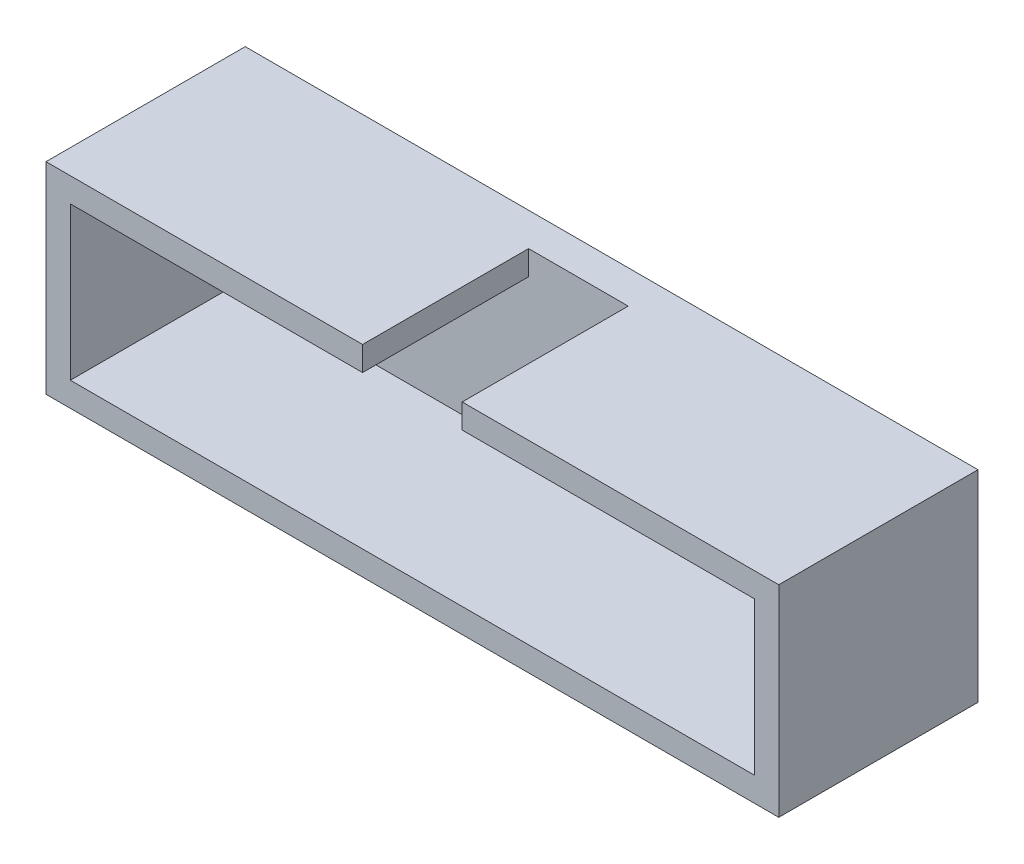
ISO-10303-21;
HEADER;
FILE_DESCRIPTION(('STEP AP214'),'2;1');
FILE_NAME('part.step','',(''),(''),'','','');
FILE_SCHEMA(('AUTOMOTIVE_DESIGN { 1 0 10303 214 1 1 1 1 }'));
ENDSEC;
DATA;
#1=APPLICATION_CONTEXT('core data for automotive mechanical design processes');
#2=APPLICATION_PROTOCOL_DEFINITION('international standard','automotive_design',2000,#1);
#3=PRODUCT_CONTEXT('',#1,'mechanical');
#4=PRODUCT('Part','Part','',(#3));
#5=PRODUCT_RELATED_PRODUCT_CATEGORY('part','',(#4));
#6=PRODUCT_DEFINITION_FORMATION('','',#4);
#7=PRODUCT_DEFINITION_CONTEXT('part definition',#1,'design');
#8=PRODUCT_DEFINITION('design','',#6,#7);
#9=PRODUCT_DEFINITION_SHAPE('','',#8);
#10=(LENGTH_UNIT() NAMED_UNIT(*) SI_UNIT(.MILLI.,.METRE.));
#11=(NAMED_UNIT(*) PLANE_ANGLE_UNIT() SI_UNIT($,.RADIAN.));
#12=(NAMED_UNIT(*) SI_UNIT($,.STERADIAN.) SOLID_ANGLE_UNIT());
#13=UNCERTAINTY_MEASURE_WITH_UNIT(LENGTH_MEASURE(1.E-05),#10,'distance_accuracy_value','');
#14=(GEOMETRIC_REPRESENTATION_CONTEXT(3) GLOBAL_UNCERTAINTY_ASSIGNED_CONTEXT((#13)) GLOBAL_UNIT_ASSIGNED_CONTEXT((#10,
#11,#12)) REPRESENTATION_CONTEXT('',''));
#15=CARTESIAN_POINT('',(0.,0.,0.));
#16=DIRECTION('',(0.,0.,1.));
#17=DIRECTION('',(1.,0.,0.));
#18=AXIS2_PLACEMENT_3D('',#15,#16,#17);
#19=CARTESIAN_POINT('',(15.45,3.45,1.5));
#20=DIRECTION('',(0.,1.,0.));
#21=DIRECTION('',(0.,0.,1.));
#22=AXIS2_PLACEMENT_3D('',#19,#20,#21);
#23=PLANE('',#22);
#24=DIRECTION('',(-1.,0.,0.));
#25=VECTOR('',#24,1.);
#26=CARTESIAN_POINT('',(15.45,3.45,9.));
#27=LINE('',#26,#25);
#28=CARTESIAN_POINT('',(15.45,3.45,9.));
#29=VERTEX_POINT('',#28);
#30=CARTESIAN_POINT('',(2.25,3.45,9.));
#31=VERTEX_POINT('',#30);
#32=EDGE_CURVE('E162',#29,#31,#27,.T.);
#33=ORIENTED_EDGE('',*,*,#32,.T.);
#34=DIRECTION('',(0.,0.,1.));
#35=VECTOR('',#34,1.);
#36=CARTESIAN_POINT('',(2.25,3.45,1.5));
#37=LINE('',#36,#35);
#38=CARTESIAN_POINT('',(2.25,3.45,1.5));
#39=VERTEX_POINT('',#38);
#40=EDGE_CURVE('E153',#39,#31,#37,.T.);
#41=ORIENTED_EDGE('',*,*,#40,.F.);
#42=DIRECTION('',(-1.,0.,0.));
#43=VECTOR('',#42,1.);
#44=CARTESIAN_POINT('',(15.45,3.45,1.5));
#45=LINE('',#44,#43);
#46=CARTESIAN_POINT('',(15.45,3.45,1.5));
#47=VERTEX_POINT('',#46);
#48=EDGE_CURVE('E143',#47,#39,#45,.T.);
#49=ORIENTED_EDGE('',*,*,#48,.F.);
#50=DIRECTION('',(0.,0.,1.));
#51=VECTOR('',#50,1.);
#52=CARTESIAN_POINT('',(15.45,3.45,1.5));
#53=LINE('',#52,#51);
#54=EDGE_CURVE('E183',#47,#29,#53,.T.);
#55=ORIENTED_EDGE('',*,*,#54,.T.);
#56=EDGE_LOOP('',(#33,#41,#49,#55));
#57=FACE_BOUND('',#56,.T.);
#58=ADVANCED_FACE('F35',(#57),#23,.F.);
#59=CARTESIAN_POINT('',(16.55,-4.55,9.));
#60=DIRECTION('',(-1.,0.,0.));
#61=DIRECTION('',(0.,0.,1.));
#62=AXIS2_PLACEMENT_3D('',#59,#60,#61);
#63=PLANE('',#62);
#64=DIRECTION('',(0.,1.,0.));
#65=VECTOR('',#64,1.);
#66=CARTESIAN_POINT('',(16.55,-4.55,0.));
#67=LINE('',#66,#65);
#68=CARTESIAN_POINT('',(16.55,-4.55,0.));
#69=VERTEX_POINT('',#68);
#70=CARTESIAN_POINT('',(16.55,4.55,0.));
#71=VERTEX_POINT('',#70);
#72=EDGE_CURVE('E182',#69,#71,#67,.T.);
#73=ORIENTED_EDGE('',*,*,#72,.T.);
#74=DIRECTION('',(0.,0.,-1.));
#75=VECTOR('',#74,1.);
#76=CARTESIAN_POINT('',(16.55,4.55,9.));
#77=LINE('',#76,#75);
#78=CARTESIAN_POINT('',(16.55,4.55,9.));
#79=VERTEX_POINT('',#78);
#80=EDGE_CURVE('E11',#79,#71,#77,.T.);
#81=ORIENTED_EDGE('',*,*,#80,.F.);
#82=DIRECTION('',(0.,1.,0.));
#83=VECTOR('',#82,1.);
#84=CARTESIAN_POINT('',(16.55,-4.55,9.));
#85=LINE('',#84,#83);
#86=CARTESIAN_POINT('',(16.55,-4.55,9.));
#87=VERTEX_POINT('',#86);
#88=EDGE_CURVE('E188',#87,#79,#85,.T.);
#89=ORIENTED_EDGE('',*,*,#88,.F.);
#90=DIRECTION('',(0.,0.,-1.));
#91=VECTOR('',#90,1.);
#92=CARTESIAN_POINT('',(16.55,-4.55,9.));
#93=LINE('',#92,#91);
#94=EDGE_CURVE('E199',#87,#69,#93,.T.);
#95=ORIENTED_EDGE('',*,*,#94,.T.);
#96=EDGE_LOOP('',(#73,#81,#89,#95));
#97=FACE_BOUND('',#96,.T.);
#98=ADVANCED_FACE('F37',(#97),#63,.F.);
#99=CARTESIAN_POINT('',(-16.55,4.55,9.));
#100=DIRECTION('',(0.,-1.,0.));
#101=DIRECTION('',(0.,0.,-1.));
#102=AXIS2_PLACEMENT_3D('',#99,#100,#101);
#103=PLANE('',#102);
#104=DIRECTION('',(-1.,0.,0.));
#105=VECTOR('',#104,1.);
#106=CARTESIAN_POINT('',(2.25,4.55,1.5));
#107=LINE('',#106,#105);
#108=CARTESIAN_POINT('',(2.25,4.55,1.5));
#109=VERTEX_POINT('',#108);
#110=CARTESIAN_POINT('',(-2.25,4.55,1.5));
#111=VERTEX_POINT('',#110);
#112=EDGE_CURVE('E139',#109,#111,#107,.T.);
#113=ORIENTED_EDGE('',*,*,#112,.F.);
#114=DIRECTION('',(0.,0.,1.));
#115=VECTOR('',#114,1.);
#116=CARTESIAN_POINT('',(2.25,4.55,1.5));
#117=LINE('',#116,#115);
#118=CARTESIAN_POINT('',(2.25,4.55,9.));
#119=VERTEX_POINT('',#118);
#120=EDGE_CURVE('E124',#109,#119,#117,.T.);
#121=ORIENTED_EDGE('',*,*,#120,.T.);
#122=DIRECTION('',(-1.,0.,0.));
#123=VECTOR('',#122,1.);
#124=CARTESIAN_POINT('',(-16.55,4.55,9.));
#125=LINE('',#124,#123);
#126=EDGE_CURVE('E193',#79,#119,#125,.T.);
#127=ORIENTED_EDGE('',*,*,#126,.F.);
#128=ORIENTED_EDGE('',*,*,#80,.T.);
#129=DIRECTION('',(-1.,0.,0.));
#130=VECTOR('',#129,1.);
#131=CARTESIAN_POINT('',(-16.55,4.55,0.));
#132=LINE('',#131,#130);
#133=CARTESIAN_POINT('',(-16.55,4.55,0.));
#134=VERTEX_POINT('',#133);
#135=EDGE_CURVE('E202',#71,#134,#132,.T.);
#136=ORIENTED_EDGE('',*,*,#135,.T.);
#137=DIRECTION('',(0.,0.,-1.));
#138=VECTOR('',#137,1.);
#139=CARTESIAN_POINT('',(-16.55,4.55,9.));
#140=LINE('',#139,#138);
#141=CARTESIAN_POINT('',(-16.55,4.55,9.));
#142=VERTEX_POINT('',#141);
#143=EDGE_CURVE('E43',#142,#134,#140,.T.);
#144=ORIENTED_EDGE('',*,*,#143,.F.);
#145=CARTESIAN_POINT('',(-2.25,4.55,9.));
#146=VERTEX_POINT('',#145);
#147=EDGE_CURVE('E191',#146,#142,#125,.T.);
#148=ORIENTED_EDGE('',*,*,#147,.F.);
#149=DIRECTION('',(0.,0.,1.));
#150=VECTOR('',#149,1.);
#151=CARTESIAN_POINT('',(-2.25,4.55,1.5));
#152=LINE('',#151,#150);
#153=EDGE_CURVE('E134',#111,#146,#152,.T.);
#154=ORIENTED_EDGE('',*,*,#153,.F.);
#155=EDGE_LOOP('',(#113,#121,#127,#128,#136,#144,#148,#154));
#156=FACE_BOUND('',#155,.T.);
#157=ADVANCED_FACE('F146',(#156),#103,.F.);
#158=CARTESIAN_POINT('',(-16.55,-4.55,9.));
#159=DIRECTION('',(1.,0.,0.));
#160=DIRECTION('',(0.,0.,-1.));
#161=AXIS2_PLACEMENT_3D('',#158,#159,#160);
#162=PLANE('',#161);
#163=DIRECTION('',(0.,-1.,0.));
#164=VECTOR('',#163,1.);
#165=CARTESIAN_POINT('',(-16.55,-4.55,0.));
#166=LINE('',#165,#164);
#167=CARTESIAN_POINT('',(-16.55,-4.55,0.));
#168=VERTEX_POINT('',#167);
#169=EDGE_CURVE('E204',#134,#168,#166,.T.);
#170=ORIENTED_EDGE('',*,*,#169,.T.);
#171=DIRECTION('',(0.,0.,-1.));
#172=VECTOR('',#171,1.);
#173=CARTESIAN_POINT('',(-16.55,-4.55,9.));
#174=LINE('',#173,#172);
#175=CARTESIAN_POINT('',(-16.55,-4.55,9.));
#176=VERTEX_POINT('',#175);
#177=EDGE_CURVE('E209',#176,#168,#174,.T.);
#178=ORIENTED_EDGE('',*,*,#177,.F.);
#179=DIRECTION('',(0.,-1.,0.));
#180=VECTOR('',#179,1.);
#181=CARTESIAN_POINT('',(-16.55,-4.55,9.));
#182=LINE('',#181,#180);
#183=EDGE_CURVE('E195',#142,#176,#182,.T.);
#184=ORIENTED_EDGE('',*,*,#183,.F.);
#185=ORIENTED_EDGE('',*,*,#143,.T.);
#186=EDGE_LOOP('',(#170,#178,#184,#185));
#187=FACE_BOUND('',#186,.T.);
#188=ADVANCED_FACE('F216',(#187),#162,.F.);
#189=CARTESIAN_POINT('',(-16.55,-4.55,9.));
#190=DIRECTION('',(0.,1.,0.));
#191=DIRECTION('',(0.,0.,1.));
#192=AXIS2_PLACEMENT_3D('',#189,#190,#191);
#193=PLANE('',#192);
#194=DIRECTION('',(1.,0.,0.));
#195=VECTOR('',#194,1.);
#196=CARTESIAN_POINT('',(-16.55,-4.55,0.));
#197=LINE('',#196,#195);
#198=EDGE_CURVE('E192',#168,#69,#197,.T.);
#199=ORIENTED_EDGE('',*,*,#198,.T.);
#200=ORIENTED_EDGE('',*,*,#94,.F.);
#201=DIRECTION('',(1.,0.,0.));
#202=VECTOR('',#201,1.);
#203=CARTESIAN_POINT('',(-16.55,-4.55,9.));
#204=LINE('',#203,#202);
#205=EDGE_CURVE('E197',#176,#87,#204,.T.);
#206=ORIENTED_EDGE('',*,*,#205,.F.);
#207=ORIENTED_EDGE('',*,*,#177,.T.);
#208=EDGE_LOOP('',(#199,#200,#206,#207));
#209=FACE_BOUND('',#208,.T.);
#210=ADVANCED_FACE('F224',(#209),#193,.F.);
#211=CARTESIAN_POINT('',(0.,0.,9.));
#212=DIRECTION('',(0.,0.,-1.));
#213=DIRECTION('',(-1.,0.,0.));
#214=AXIS2_PLACEMENT_3D('',#211,#212,#213);
#215=PLANE('',#214);
#216=ORIENTED_EDGE('',*,*,#126,.T.);
#217=DIRECTION('',(0.,1.,0.));
#218=VECTOR('',#217,1.);
#219=CARTESIAN_POINT('',(2.25,4.55,9.));
#220=LINE('',#219,#218);
#221=EDGE_CURVE('E130',#31,#119,#220,.T.);
#222=ORIENTED_EDGE('',*,*,#221,.F.);
#223=ORIENTED_EDGE('',*,*,#32,.F.);
#224=DIRECTION('',(0.,1.,0.));
#225=VECTOR('',#224,1.);
#226=CARTESIAN_POINT('',(15.45,-3.45,9.));
#227=LINE('',#226,#225);
#228=CARTESIAN_POINT('',(15.45,-3.45,9.));
#229=VERTEX_POINT('',#228);
#230=EDGE_CURVE('E174',#229,#29,#227,.T.);
#231=ORIENTED_EDGE('',*,*,#230,.F.);
#232=DIRECTION('',(1.,0.,0.));
#233=VECTOR('',#232,1.);
#234=CARTESIAN_POINT('',(15.45,-3.45,9.));
#235=LINE('',#234,#233);
#236=CARTESIAN_POINT('',(-15.45,-3.45,9.));
#237=VERTEX_POINT('',#236);
#238=EDGE_CURVE('E171',#237,#229,#235,.T.);
#239=ORIENTED_EDGE('',*,*,#238,.F.);
#240=DIRECTION('',(0.,-1.,0.));
#241=VECTOR('',#240,1.);
#242=CARTESIAN_POINT('',(-15.45,-3.45,9.));
#243=LINE('',#242,#241);
#244=CARTESIAN_POINT('',(-15.45,3.45,9.));
#245=VERTEX_POINT('',#244);
#246=EDGE_CURVE('E58',#245,#237,#243,.T.);
#247=ORIENTED_EDGE('',*,*,#246,.F.);
#248=CARTESIAN_POINT('',(-2.25,3.45,9.));
#249=VERTEX_POINT('',#248);
#250=EDGE_CURVE('E177',#249,#245,#27,.T.);
#251=ORIENTED_EDGE('',*,*,#250,.F.);
#252=DIRECTION('',(0.,-1.,0.));
#253=VECTOR('',#252,1.);
#254=CARTESIAN_POINT('',(-2.25,4.55,9.));
#255=LINE('',#254,#253);
#256=EDGE_CURVE('E144',#146,#249,#255,.T.);
#257=ORIENTED_EDGE('',*,*,#256,.F.);
#258=ORIENTED_EDGE('',*,*,#147,.T.);
#259=ORIENTED_EDGE('',*,*,#183,.T.);
#260=ORIENTED_EDGE('',*,*,#205,.T.);
#261=ORIENTED_EDGE('',*,*,#88,.T.);
#262=EDGE_LOOP('',(#216,#222,#223,#231,#239,#247,#251,#257,#258,#259,#260,#261));
#263=FACE_BOUND('',#262,.T.);
#264=ADVANCED_FACE('F230',(#263),#215,.F.);
#265=CARTESIAN_POINT('',(0.,0.,0.));
#266=DIRECTION('',(0.,0.,-1.));
#267=DIRECTION('',(-1.,0.,0.));
#268=AXIS2_PLACEMENT_3D('',#265,#266,#267);
#269=PLANE('',#268);
#270=ORIENTED_EDGE('',*,*,#72,.F.);
#271=ORIENTED_EDGE('',*,*,#198,.F.);
#272=ORIENTED_EDGE('',*,*,#169,.F.);
#273=ORIENTED_EDGE('',*,*,#135,.F.);
#274=EDGE_LOOP('',(#270,#271,#272,#273));
#275=FACE_BOUND('',#274,.T.);
#276=ADVANCED_FACE('F221',(#275),#269,.T.);
#277=CARTESIAN_POINT('',(-15.45,-3.45,1.5));
#278=DIRECTION('',(-1.,0.,0.));
#279=DIRECTION('',(0.,0.,1.));
#280=AXIS2_PLACEMENT_3D('',#277,#278,#279);
#281=PLANE('',#280);
#282=ORIENTED_EDGE('',*,*,#246,.T.);
#283=DIRECTION('',(0.,0.,1.));
#284=VECTOR('',#283,1.);
#285=CARTESIAN_POINT('',(-15.45,-3.45,1.5));
#286=LINE('',#285,#284);
#287=CARTESIAN_POINT('',(-15.45,-3.45,1.5));
#288=VERTEX_POINT('',#287);
#289=EDGE_CURVE('E169',#288,#237,#286,.T.);
#290=ORIENTED_EDGE('',*,*,#289,.F.);
#291=DIRECTION('',(0.,-1.,0.));
#292=VECTOR('',#291,1.);
#293=CARTESIAN_POINT('',(-15.45,-3.45,1.5));
#294=LINE('',#293,#292);
#295=CARTESIAN_POINT('',(-15.45,3.45,1.5));
#296=VERTEX_POINT('',#295);
#297=EDGE_CURVE('E159',#296,#288,#294,.T.);
#298=ORIENTED_EDGE('',*,*,#297,.F.);
#299=DIRECTION('',(0.,0.,1.));
#300=VECTOR('',#299,1.);
#301=CARTESIAN_POINT('',(-15.45,3.45,1.5));
#302=LINE('',#301,#300);
#303=EDGE_CURVE('E180',#296,#245,#302,.T.);
#304=ORIENTED_EDGE('',*,*,#303,.T.);
#305=EDGE_LOOP('',(#282,#290,#298,#304));
#306=FACE_BOUND('',#305,.T.);
#307=ADVANCED_FACE('F241',(#306),#281,.F.);
#308=CARTESIAN_POINT('',(-2.24999999999999,3.45,1.5));
#309=VERTEX_POINT('',#308);
#310=EDGE_CURVE('E167',#309,#296,#45,.T.);
#311=ORIENTED_EDGE('',*,*,#310,.F.);
#312=DIRECTION('',(0.,0.,1.));
#313=VECTOR('',#312,1.);
#314=CARTESIAN_POINT('',(-2.25,3.45,1.5));
#315=LINE('',#314,#313);
#316=EDGE_CURVE('E155',#309,#249,#315,.T.);
#317=ORIENTED_EDGE('',*,*,#316,.T.);
#318=ORIENTED_EDGE('',*,*,#250,.T.);
#319=ORIENTED_EDGE('',*,*,#303,.F.);
#320=EDGE_LOOP('',(#311,#317,#318,#319));
#321=FACE_BOUND('',#320,.T.);
#322=ADVANCED_FACE('F237',(#321),#23,.F.);
#323=CARTESIAN_POINT('',(15.45,-3.45,1.5));
#324=DIRECTION('',(1.,0.,0.));
#325=DIRECTION('',(0.,0.,-1.));
#326=AXIS2_PLACEMENT_3D('',#323,#324,#325);
#327=PLANE('',#326);
#328=ORIENTED_EDGE('',*,*,#230,.T.);
#329=ORIENTED_EDGE('',*,*,#54,.F.);
#330=DIRECTION('',(0.,1.,0.));
#331=VECTOR('',#330,1.);
#332=CARTESIAN_POINT('',(15.45,-3.45,1.5));
#333=LINE('',#332,#331);
#334=CARTESIAN_POINT('',(15.45,-3.45,1.5));
#335=VERTEX_POINT('',#334);
#336=EDGE_CURVE('E165',#335,#47,#333,.T.);
#337=ORIENTED_EDGE('',*,*,#336,.F.);
#338=DIRECTION('',(0.,0.,1.));
#339=VECTOR('',#338,1.);
#340=CARTESIAN_POINT('',(15.45,-3.45,1.5));
#341=LINE('',#340,#339);
#342=EDGE_CURVE('E185',#335,#229,#341,.T.);
#343=ORIENTED_EDGE('',*,*,#342,.T.);
#344=EDGE_LOOP('',(#328,#329,#337,#343));
#345=FACE_BOUND('',#344,.T.);
#346=ADVANCED_FACE('F248',(#345),#327,.F.);
#347=CARTESIAN_POINT('',(15.45,-3.45,1.5));
#348=DIRECTION('',(0.,-1.,0.));
#349=DIRECTION('',(0.,0.,-1.));
#350=AXIS2_PLACEMENT_3D('',#347,#348,#349);
#351=PLANE('',#350);
#352=ORIENTED_EDGE('',*,*,#238,.T.);
#353=ORIENTED_EDGE('',*,*,#342,.F.);
#354=DIRECTION('',(1.,0.,0.));
#355=VECTOR('',#354,1.);
#356=CARTESIAN_POINT('',(15.45,-3.45,1.5));
#357=LINE('',#356,#355);
#358=EDGE_CURVE('E161',#288,#335,#357,.T.);
#359=ORIENTED_EDGE('',*,*,#358,.F.);
#360=ORIENTED_EDGE('',*,*,#289,.T.);
#361=EDGE_LOOP('',(#352,#353,#359,#360));
#362=FACE_BOUND('',#361,.T.);
#363=ADVANCED_FACE('F244',(#362),#351,.F.);
#364=CARTESIAN_POINT('',(0.,0.,1.5));
#365=DIRECTION('',(0.,0.,1.));
#366=DIRECTION('',(1.,0.,0.));
#367=AXIS2_PLACEMENT_3D('',#364,#365,#366);
#368=PLANE('',#367);
#369=ORIENTED_EDGE('',*,*,#297,.T.);
#370=ORIENTED_EDGE('',*,*,#358,.T.);
#371=ORIENTED_EDGE('',*,*,#336,.T.);
#372=ORIENTED_EDGE('',*,*,#48,.T.);
#373=DIRECTION('',(0.,1.,0.));
#374=VECTOR('',#373,1.);
#375=CARTESIAN_POINT('',(2.25,4.55,1.5));
#376=LINE('',#375,#374);
#377=EDGE_CURVE('E127',#39,#109,#376,.T.);
#378=ORIENTED_EDGE('',*,*,#377,.T.);
#379=ORIENTED_EDGE('',*,*,#112,.T.);
#380=DIRECTION('',(0.,-1.,0.));
#381=VECTOR('',#380,1.);
#382=CARTESIAN_POINT('',(-2.25,4.55,1.5));
#383=LINE('',#382,#381);
#384=EDGE_CURVE('E50',#111,#309,#383,.T.);
#385=ORIENTED_EDGE('',*,*,#384,.T.);
#386=ORIENTED_EDGE('',*,*,#310,.T.);
#387=EDGE_LOOP('',(#369,#370,#371,#372,#378,#379,#385,#386));
#388=FACE_BOUND('',#387,.T.);
#389=ADVANCED_FACE('F138',(#388),#368,.T.);
#390=CARTESIAN_POINT('',(2.25,4.55,1.5));
#391=DIRECTION('',(1.,0.,0.));
#392=DIRECTION('',(0.,1.,0.));
#393=AXIS2_PLACEMENT_3D('',#390,#391,#392);
#394=PLANE('',#393);
#395=ORIENTED_EDGE('',*,*,#221,.T.);
#396=ORIENTED_EDGE('',*,*,#120,.F.);
#397=ORIENTED_EDGE('',*,*,#377,.F.);
#398=ORIENTED_EDGE('',*,*,#40,.T.);
#399=EDGE_LOOP('',(#395,#396,#397,#398));
#400=FACE_BOUND('',#399,.T.);
#401=ADVANCED_FACE('F126',(#400),#394,.F.);
#402=CARTESIAN_POINT('',(-2.25,4.55,1.5));
#403=DIRECTION('',(-1.,0.,0.));
#404=DIRECTION('',(0.,-1.,0.));
#405=AXIS2_PLACEMENT_3D('',#402,#403,#404);
#406=PLANE('',#405);
#407=ORIENTED_EDGE('',*,*,#256,.T.);
#408=ORIENTED_EDGE('',*,*,#316,.F.);
#409=ORIENTED_EDGE('',*,*,#384,.F.);
#410=ORIENTED_EDGE('',*,*,#153,.T.);
#411=EDGE_LOOP('',(#407,#408,#409,#410));
#412=FACE_BOUND('',#411,.T.);
#413=ADVANCED_FACE('F234',(#412),#406,.F.);
#414=CLOSED_SHELL('',(#58,#98,#157,#188,#210,#264,#276,#307,#322,#346,#363,#389,#401,#413));
#415=MANIFOLD_SOLID_BREP('B2',#414);
#416=ADVANCED_BREP_SHAPE_REPRESENTATION('',(#18,#415),#14);
#417=SHAPE_DEFINITION_REPRESENTATION(#9,#416);
ENDSEC;
END-ISO-10303-21;
